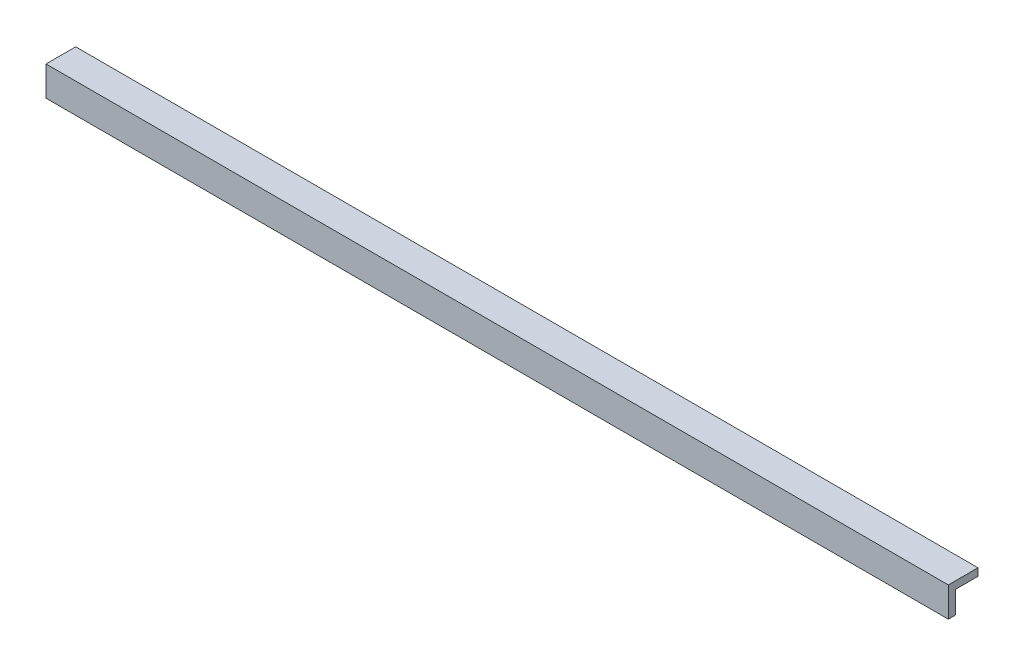
ISO-10303-21;
HEADER;
FILE_DESCRIPTION(('STEP AP214'),'2;1');
FILE_NAME('part.step','',(''),(''),'','','');
FILE_SCHEMA(('AUTOMOTIVE_DESIGN { 1 0 10303 214 1 1 1 1 }'));
ENDSEC;
DATA;
#1=APPLICATION_CONTEXT('core data for automotive mechanical design processes');
#2=APPLICATION_PROTOCOL_DEFINITION('international standard','automotive_design',2000,#1);
#3=PRODUCT_CONTEXT('',#1,'mechanical');
#4=PRODUCT('Part','Part','',(#3));
#5=PRODUCT_RELATED_PRODUCT_CATEGORY('part','',(#4));
#6=PRODUCT_DEFINITION_FORMATION('','',#4);
#7=PRODUCT_DEFINITION_CONTEXT('part definition',#1,'design');
#8=PRODUCT_DEFINITION('design','',#6,#7);
#9=PRODUCT_DEFINITION_SHAPE('','',#8);
#10=(LENGTH_UNIT() NAMED_UNIT(*) SI_UNIT(.MILLI.,.METRE.));
#11=(NAMED_UNIT(*) PLANE_ANGLE_UNIT() SI_UNIT($,.RADIAN.));
#12=(NAMED_UNIT(*) SI_UNIT($,.STERADIAN.) SOLID_ANGLE_UNIT());
#13=UNCERTAINTY_MEASURE_WITH_UNIT(LENGTH_MEASURE(1.E-05),#10,'distance_accuracy_value','');
#14=(GEOMETRIC_REPRESENTATION_CONTEXT(3) GLOBAL_UNCERTAINTY_ASSIGNED_CONTEXT((#13)) GLOBAL_UNIT_ASSIGNED_CONTEXT((#10,
#11,#12)) REPRESENTATION_CONTEXT('',''));
#15=CARTESIAN_POINT('',(0.,0.,0.));
#16=DIRECTION('',(0.,0.,1.));
#17=DIRECTION('',(1.,0.,0.));
#18=AXIS2_PLACEMENT_3D('',#15,#16,#17);
#19=CARTESIAN_POINT('',(193.04,0.,-1.5875));
#20=DIRECTION('',(0.,1.,0.));
#21=DIRECTION('',(0.,0.,1.));
#22=AXIS2_PLACEMENT_3D('',#19,#20,#21);
#23=PLANE('',#22);
#24=DIRECTION('',(0.,0.,-1.));
#25=VECTOR('',#24,1.);
#26=CARTESIAN_POINT('',(0.,0.,-1.5875));
#27=LINE('',#26,#25);
#28=CARTESIAN_POINT('',(0.,0.,0.));
#29=VERTEX_POINT('',#28);
#30=CARTESIAN_POINT('',(0.,0.,-1.5875));
#31=VERTEX_POINT('',#30);
#32=EDGE_CURVE('E144',#29,#31,#27,.T.);
#33=ORIENTED_EDGE('',*,*,#32,.T.);
#34=DIRECTION('',(-1.,0.,0.));
#35=VECTOR('',#34,1.);
#36=CARTESIAN_POINT('',(193.04,0.,-1.5875));
#37=LINE('',#36,#35);
#38=CARTESIAN_POINT('',(193.04,0.,-1.5875));
#39=VERTEX_POINT('',#38);
#40=EDGE_CURVE('E11',#39,#31,#37,.T.);
#41=ORIENTED_EDGE('',*,*,#40,.F.);
#42=DIRECTION('',(0.,0.,-1.));
#43=VECTOR('',#42,1.);
#44=CARTESIAN_POINT('',(193.04,0.,-1.5875));
#45=LINE('',#44,#43);
#46=CARTESIAN_POINT('',(193.04,0.,0.));
#47=VERTEX_POINT('',#46);
#48=EDGE_CURVE('E160',#47,#39,#45,.T.);
#49=ORIENTED_EDGE('',*,*,#48,.F.);
#50=DIRECTION('',(-1.,0.,0.));
#51=VECTOR('',#50,1.);
#52=CARTESIAN_POINT('',(193.04,0.,0.));
#53=LINE('',#52,#51);
#54=EDGE_CURVE('E140',#47,#29,#53,.T.);
#55=ORIENTED_EDGE('',*,*,#54,.T.);
#56=EDGE_LOOP('',(#33,#41,#49,#55));
#57=FACE_BOUND('',#56,.T.);
#58=ADVANCED_FACE('F41',(#57),#23,.F.);
#59=CARTESIAN_POINT('',(193.04,4.7625,-1.5875));
#60=DIRECTION('',(0.,0.,1.));
#61=DIRECTION('',(0.,-1.,0.));
#62=AXIS2_PLACEMENT_3D('',#59,#60,#61);
#63=PLANE('',#62);
#64=DIRECTION('',(0.,1.,0.));
#65=VECTOR('',#64,1.);
#66=CARTESIAN_POINT('',(0.,4.7625,-1.5875));
#67=LINE('',#66,#65);
#68=CARTESIAN_POINT('',(0.,4.7625,-1.5875));
#69=VERTEX_POINT('',#68);
#70=EDGE_CURVE('E148',#31,#69,#67,.T.);
#71=ORIENTED_EDGE('',*,*,#70,.T.);
#72=DIRECTION('',(-1.,0.,0.));
#73=VECTOR('',#72,1.);
#74=CARTESIAN_POINT('',(193.04,4.7625,-1.5875));
#75=LINE('',#74,#73);
#76=CARTESIAN_POINT('',(193.04,4.7625,-1.5875));
#77=VERTEX_POINT('',#76);
#78=EDGE_CURVE('E50',#77,#69,#75,.T.);
#79=ORIENTED_EDGE('',*,*,#78,.F.);
#80=DIRECTION('',(0.,1.,0.));
#81=VECTOR('',#80,1.);
#82=CARTESIAN_POINT('',(193.04,4.7625,-1.5875));
#83=LINE('',#82,#81);
#84=EDGE_CURVE('E105',#39,#77,#83,.T.);
#85=ORIENTED_EDGE('',*,*,#84,.F.);
#86=ORIENTED_EDGE('',*,*,#40,.T.);
#87=EDGE_LOOP('',(#71,#79,#85,#86));
#88=FACE_BOUND('',#87,.T.);
#89=ADVANCED_FACE('F188',(#88),#63,.F.);
#90=CARTESIAN_POINT('',(193.04,4.7625,-6.35));
#91=DIRECTION('',(0.,1.,0.));
#92=DIRECTION('',(0.,0.,1.));
#93=AXIS2_PLACEMENT_3D('',#90,#91,#92);
#94=PLANE('',#93);
#95=DIRECTION('',(0.,0.,-1.));
#96=VECTOR('',#95,1.);
#97=CARTESIAN_POINT('',(0.,4.7625,-6.35));
#98=LINE('',#97,#96);
#99=CARTESIAN_POINT('',(0.,4.7625,-6.35));
#100=VERTEX_POINT('',#99);
#101=EDGE_CURVE('E151',#69,#100,#98,.T.);
#102=ORIENTED_EDGE('',*,*,#101,.T.);
#103=DIRECTION('',(-1.,0.,0.));
#104=VECTOR('',#103,1.);
#105=CARTESIAN_POINT('',(193.04,4.7625,-6.35));
#106=LINE('',#105,#104);
#107=CARTESIAN_POINT('',(193.04,4.7625,-6.35));
#108=VERTEX_POINT('',#107);
#109=EDGE_CURVE('E131',#108,#100,#106,.T.);
#110=ORIENTED_EDGE('',*,*,#109,.F.);
#111=DIRECTION('',(0.,0.,-1.));
#112=VECTOR('',#111,1.);
#113=CARTESIAN_POINT('',(193.04,4.7625,-6.35));
#114=LINE('',#113,#112);
#115=EDGE_CURVE('E120',#77,#108,#114,.T.);
#116=ORIENTED_EDGE('',*,*,#115,.F.);
#117=ORIENTED_EDGE('',*,*,#78,.T.);
#118=EDGE_LOOP('',(#102,#110,#116,#117));
#119=FACE_BOUND('',#118,.T.);
#120=ADVANCED_FACE('F170',(#119),#94,.F.);
#121=CARTESIAN_POINT('',(193.04,6.35,-6.35));
#122=DIRECTION('',(0.,0.,1.));
#123=DIRECTION('',(1.,0.,0.));
#124=AXIS2_PLACEMENT_3D('',#121,#122,#123);
#125=PLANE('',#124);
#126=DIRECTION('',(0.,1.,0.));
#127=VECTOR('',#126,1.);
#128=CARTESIAN_POINT('',(0.,6.35,-6.35));
#129=LINE('',#128,#127);
#130=CARTESIAN_POINT('',(0.,6.35,-6.35));
#131=VERTEX_POINT('',#130);
#132=EDGE_CURVE('E129',#100,#131,#129,.T.);
#133=ORIENTED_EDGE('',*,*,#132,.T.);
#134=DIRECTION('',(-1.,0.,0.));
#135=VECTOR('',#134,1.);
#136=CARTESIAN_POINT('',(193.04,6.35,-6.35));
#137=LINE('',#136,#135);
#138=CARTESIAN_POINT('',(193.04,6.35,-6.35));
#139=VERTEX_POINT('',#138);
#140=EDGE_CURVE('E126',#139,#131,#137,.T.);
#141=ORIENTED_EDGE('',*,*,#140,.F.);
#142=DIRECTION('',(0.,1.,0.));
#143=VECTOR('',#142,1.);
#144=CARTESIAN_POINT('',(193.04,6.35,-6.35));
#145=LINE('',#144,#143);
#146=EDGE_CURVE('E114',#108,#139,#145,.T.);
#147=ORIENTED_EDGE('',*,*,#146,.F.);
#148=ORIENTED_EDGE('',*,*,#109,.T.);
#149=EDGE_LOOP('',(#133,#141,#147,#148));
#150=FACE_BOUND('',#149,.T.);
#151=ADVANCED_FACE('F127',(#150),#125,.F.);
#152=CARTESIAN_POINT('',(193.04,6.35,0.));
#153=DIRECTION('',(0.,-1.,0.));
#154=DIRECTION('',(0.,0.,-1.));
#155=AXIS2_PLACEMENT_3D('',#152,#153,#154);
#156=PLANE('',#155);
#157=DIRECTION('',(0.,0.,1.));
#158=VECTOR('',#157,1.);
#159=CARTESIAN_POINT('',(0.,6.35,0.));
#160=LINE('',#159,#158);
#161=CARTESIAN_POINT('',(0.,6.35,0.));
#162=VERTEX_POINT('',#161);
#163=EDGE_CURVE('E89',#131,#162,#160,.T.);
#164=ORIENTED_EDGE('',*,*,#163,.T.);
#165=DIRECTION('',(-1.,0.,0.));
#166=VECTOR('',#165,1.);
#167=CARTESIAN_POINT('',(193.04,6.35,0.));
#168=LINE('',#167,#166);
#169=CARTESIAN_POINT('',(193.04,6.35,0.));
#170=VERTEX_POINT('',#169);
#171=EDGE_CURVE('E132',#170,#162,#168,.T.);
#172=ORIENTED_EDGE('',*,*,#171,.F.);
#173=DIRECTION('',(0.,0.,1.));
#174=VECTOR('',#173,1.);
#175=CARTESIAN_POINT('',(193.04,6.35,0.));
#176=LINE('',#175,#174);
#177=EDGE_CURVE('E118',#139,#170,#176,.T.);
#178=ORIENTED_EDGE('',*,*,#177,.F.);
#179=ORIENTED_EDGE('',*,*,#140,.T.);
#180=EDGE_LOOP('',(#164,#172,#178,#179));
#181=FACE_BOUND('',#180,.T.);
#182=ADVANCED_FACE('F134',(#181),#156,.F.);
#183=CARTESIAN_POINT('',(193.04,0.,0.));
#184=DIRECTION('',(0.,0.,-1.));
#185=DIRECTION('',(-1.,0.,0.));
#186=AXIS2_PLACEMENT_3D('',#183,#184,#185);
#187=PLANE('',#186);
#188=DIRECTION('',(0.,-1.,0.));
#189=VECTOR('',#188,1.);
#190=CARTESIAN_POINT('',(0.,0.,0.));
#191=LINE('',#190,#189);
#192=EDGE_CURVE('E96',#162,#29,#191,.T.);
#193=ORIENTED_EDGE('',*,*,#192,.T.);
#194=ORIENTED_EDGE('',*,*,#54,.F.);
#195=DIRECTION('',(0.,-1.,0.));
#196=VECTOR('',#195,1.);
#197=CARTESIAN_POINT('',(193.04,0.,0.));
#198=LINE('',#197,#196);
#199=EDGE_CURVE('E61',#170,#47,#198,.T.);
#200=ORIENTED_EDGE('',*,*,#199,.F.);
#201=ORIENTED_EDGE('',*,*,#171,.T.);
#202=EDGE_LOOP('',(#193,#194,#200,#201));
#203=FACE_BOUND('',#202,.T.);
#204=ADVANCED_FACE('F177',(#203),#187,.F.);
#205=CARTESIAN_POINT('',(193.04,0.,0.));
#206=DIRECTION('',(-1.,0.,0.));
#207=DIRECTION('',(0.,0.,1.));
#208=AXIS2_PLACEMENT_3D('',#205,#206,#207);
#209=PLANE('',#208);
#210=ORIENTED_EDGE('',*,*,#48,.T.);
#211=ORIENTED_EDGE('',*,*,#84,.T.);
#212=ORIENTED_EDGE('',*,*,#115,.T.);
#213=ORIENTED_EDGE('',*,*,#146,.T.);
#214=ORIENTED_EDGE('',*,*,#177,.T.);
#215=ORIENTED_EDGE('',*,*,#199,.T.);
#216=EDGE_LOOP('',(#210,#211,#212,#213,#214,#215));
#217=FACE_BOUND('',#216,.T.);
#218=ADVANCED_FACE('F116',(#217),#209,.F.);
#219=CARTESIAN_POINT('',(0.,0.,0.));
#220=DIRECTION('',(-1.,0.,0.));
#221=DIRECTION('',(0.,0.,1.));
#222=AXIS2_PLACEMENT_3D('',#219,#220,#221);
#223=PLANE('',#222);
#224=ORIENTED_EDGE('',*,*,#32,.F.);
#225=ORIENTED_EDGE('',*,*,#192,.F.);
#226=ORIENTED_EDGE('',*,*,#163,.F.);
#227=ORIENTED_EDGE('',*,*,#132,.F.);
#228=ORIENTED_EDGE('',*,*,#101,.F.);
#229=ORIENTED_EDGE('',*,*,#70,.F.);
#230=EDGE_LOOP('',(#224,#225,#226,#227,#228,#229));
#231=FACE_BOUND('',#230,.T.);
#232=ADVANCED_FACE('F173',(#231),#223,.T.);
#233=CLOSED_SHELL('',(#58,#89,#120,#151,#182,#204,#218,#232));
#234=MANIFOLD_SOLID_BREP('B2',#233);
#235=ADVANCED_BREP_SHAPE_REPRESENTATION('',(#18,#234),#14);
#236=SHAPE_DEFINITION_REPRESENTATION(#9,#235);
ENDSEC;
END-ISO-10303-21;
